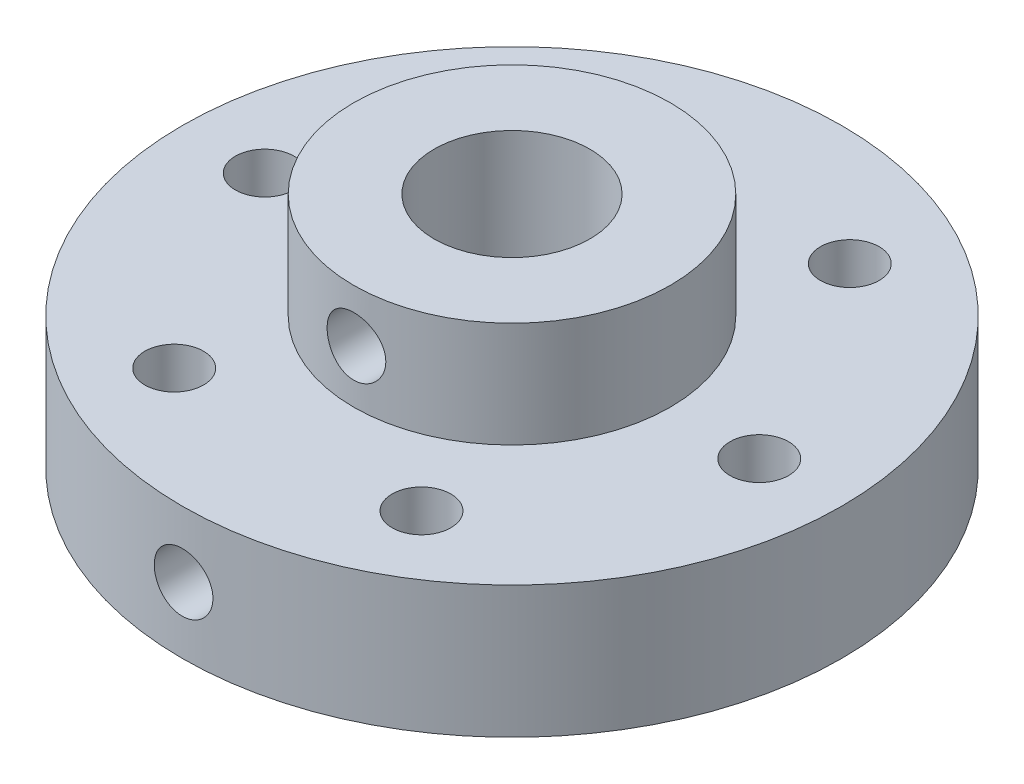
ISO-10303-21;
HEADER;
FILE_DESCRIPTION(('STEP AP214'),'2;1');
FILE_NAME('part.step','',(''),(''),'','','');
FILE_SCHEMA(('AUTOMOTIVE_DESIGN { 1 0 10303 214 1 1 1 1 }'));
ENDSEC;
DATA;
#1=APPLICATION_CONTEXT('core data for automotive mechanical design processes');
#2=APPLICATION_PROTOCOL_DEFINITION('international standard','automotive_design',2000,#1);
#3=PRODUCT_CONTEXT('',#1,'mechanical');
#4=PRODUCT('Part','Part','',(#3));
#5=PRODUCT_RELATED_PRODUCT_CATEGORY('part','',(#4));
#6=PRODUCT_DEFINITION_FORMATION('','',#4);
#7=PRODUCT_DEFINITION_CONTEXT('part definition',#1,'design');
#8=PRODUCT_DEFINITION('design','',#6,#7);
#9=PRODUCT_DEFINITION_SHAPE('','',#8);
#10=(LENGTH_UNIT() NAMED_UNIT(*) SI_UNIT(.MILLI.,.METRE.));
#11=(NAMED_UNIT(*) PLANE_ANGLE_UNIT() SI_UNIT($,.RADIAN.));
#12=(NAMED_UNIT(*) SI_UNIT($,.STERADIAN.) SOLID_ANGLE_UNIT());
#13=UNCERTAINTY_MEASURE_WITH_UNIT(LENGTH_MEASURE(1.E-05),#10,'distance_accuracy_value','');
#14=(GEOMETRIC_REPRESENTATION_CONTEXT(3) GLOBAL_UNCERTAINTY_ASSIGNED_CONTEXT((#13)) GLOBAL_UNIT_ASSIGNED_CONTEXT((#10,
#11,#12)) REPRESENTATION_CONTEXT('',''));
#15=CARTESIAN_POINT('',(0.,0.,0.));
#16=DIRECTION('',(0.,0.,1.));
#17=DIRECTION('',(1.,0.,0.));
#18=AXIS2_PLACEMENT_3D('',#15,#16,#17);
#19=CARTESIAN_POINT('',(0.,5.08,0.));
#20=DIRECTION('',(0.,-1.,0.));
#21=DIRECTION('',(0.,0.,-1.));
#22=AXIS2_PLACEMENT_3D('',#19,#20,#21);
#23=CYLINDRICAL_SURFACE('',#22,12.7);
#24=CARTESIAN_POINT('',(0.,1.40970000000001,12.7));
#25=CARTESIAN_POINT('',(-0.0633549662870578,1.40970275996524,12.6999993442662));
#26=CARTESIAN_POINT('',(-0.126752665207347,1.41504463045691,12.6995208743728));
#27=CARTESIAN_POINT('',(-0.251792843437398,1.43627511603167,12.6976581682521));
#28=CARTESIAN_POINT('',(-0.313433270551566,1.4521755746525,12.6962729149133));
#29=CARTESIAN_POINT('',(-0.433129919396754,1.49405879468067,12.6927531279238));
#30=CARTESIAN_POINT('',(-0.491188190521169,1.52003572804752,12.6906190274599));
#31=CARTESIAN_POINT('',(-0.60210692242587,1.58132379024321,12.68584065064));
#32=CARTESIAN_POINT('',(-0.65496846679239,1.61663296748804,12.6831964809823));
#33=CARTESIAN_POINT('',(-0.754159197131341,1.69569296418049,12.6776859812866));
#34=CARTESIAN_POINT('',(-0.800471309893539,1.73946516761339,12.6748190997262));
#35=CARTESIAN_POINT('',(-0.885101966605945,1.8341633345258,12.6691908973995));
#36=CARTESIAN_POINT('',(-0.923420153597667,1.88508961729169,12.6664295813516));
#37=CARTESIAN_POINT('',(-0.991034006795327,1.99275496911822,12.6613193372878));
#38=CARTESIAN_POINT('',(-1.0203145082189,2.04950359752639,12.6589711052144));
#39=CARTESIAN_POINT('',(-1.06892497046169,2.1671362454533,12.6549594154604));
#40=CARTESIAN_POINT('',(-1.08825512933881,2.22802018263292,12.6532959441501));
#41=CARTESIAN_POINT('',(-1.11636627626064,2.35202297237841,12.6508468875705));
#42=CARTESIAN_POINT('',(-1.12517526603385,2.4151354302412,12.65005897243));
#43=CARTESIAN_POINT('',(-1.13208054267278,2.54194763005313,12.6494429242787));
#44=CARTESIAN_POINT('',(-1.13017705628481,2.60564735954326,12.6496147709531));
#45=CARTESIAN_POINT('',(-1.11573453505945,2.73163364643222,12.6508967086965));
#46=CARTESIAN_POINT('',(-1.10322597749987,2.79392372880229,12.6520041110958));
#47=CARTESIAN_POINT('',(-1.06797575874834,2.91551680096642,12.6550281729631));
#48=CARTESIAN_POINT('',(-1.04523398531445,2.97481975798859,12.6569448413074));
#49=CARTESIAN_POINT('',(-0.990128920983868,3.0888520409167,12.661374570342));
#50=CARTESIAN_POINT('',(-0.957752004966513,3.14357474850884,12.6638884745654));
#51=CARTESIAN_POINT('',(-0.884305528900145,3.246820765042,12.6692286657573));
#52=CARTESIAN_POINT('',(-0.843235767712836,3.29534393049405,12.6720549599532));
#53=CARTESIAN_POINT('',(-0.753398711268006,3.38499064342493,12.6777134478915));
#54=CARTESIAN_POINT('',(-0.704605076649214,3.42608780111356,12.6805456278451));
#55=CARTESIAN_POINT('',(-0.60079709839181,3.49951170078229,12.6858874119665));
#56=CARTESIAN_POINT('',(-0.545782749786353,3.53183843575969,12.6883970158769));
#57=CARTESIAN_POINT('',(-0.431077483891176,3.58680239672926,12.692811467624));
#58=CARTESIAN_POINT('',(-0.371385977360791,3.60943839952807,12.6947162391092));
#59=CARTESIAN_POINT('',(-0.249028930160307,3.64435959074977,12.6977055702252));
#60=CARTESIAN_POINT('',(-0.186363459939341,3.65664502423433,12.698790149275));
#61=CARTESIAN_POINT('',(-0.0600660041406304,3.6704831265007,12.7000144007699));
#62=CARTESIAN_POINT('',(0.00356195903674059,3.6720722351296,12.7001572813243));
#63=CARTESIAN_POINT('',(0.130179123062569,3.66456811790858,12.6994906162937));
#64=CARTESIAN_POINT('',(0.193168330713415,3.65547500593908,12.6986810808622));
#65=CARTESIAN_POINT('',(0.316615641736332,3.62689477944628,12.6962026618106));
#66=CARTESIAN_POINT('',(0.377077698751923,3.60742461024132,12.6945351793369));
#67=CARTESIAN_POINT('',(0.493877017716604,3.55866029739495,12.6905281036814));
#68=CARTESIAN_POINT('',(0.550214205605929,3.52936597741896,12.6881884984357));
#69=CARTESIAN_POINT('',(0.657330068574675,3.46169373241325,12.6830912656799));
#70=CARTESIAN_POINT('',(0.708093479326382,3.42329173027503,12.6803325372428));
#71=CARTESIAN_POINT('',(0.80246657991546,3.33852891040848,12.6747105175415));
#72=CARTESIAN_POINT('',(0.846076127884288,3.29216793488274,12.6718472242049));
#73=CARTESIAN_POINT('',(0.925029072785661,3.19264477851914,12.6663292375558));
#74=CARTESIAN_POINT('',(0.960348646577448,3.1394636596163,12.6636751596436));
#75=CARTESIAN_POINT('',(1.0215555683374,3.0279038233009,12.6588850522987));
#76=CARTESIAN_POINT('',(1.0474430217618,2.96952516400875,12.6567490170742));
#77=CARTESIAN_POINT('',(1.08901049476346,2.8493109072017,12.6532404409206));
#78=CARTESIAN_POINT('',(1.10470496682232,2.78748033987342,12.6518668193799));
#79=CARTESIAN_POINT('',(1.12548797292162,2.66204883559887,12.6500350747212));
#80=CARTESIAN_POINT('',(1.1305767425878,2.59844793801565,12.649576931264));
#81=CARTESIAN_POINT('',(1.13000099869347,2.47151792687397,12.6496283581756));
#82=CARTESIAN_POINT('',(1.12437391313382,2.40818863882937,12.6501345603107));
#83=CARTESIAN_POINT('',(1.10260437390431,2.28337852391187,12.6520504780416));
#84=CARTESIAN_POINT('',(1.08646190541541,2.2218976996441,12.6534601949107));
#85=CARTESIAN_POINT('',(1.04412958765887,2.10252818113132,12.6570234016182));
#86=CARTESIAN_POINT('',(1.01794055344363,2.04463919593201,12.6591768311197));
#87=CARTESIAN_POINT('',(0.956262575165948,1.93407320902907,12.6639849385614));
#88=CARTESIAN_POINT('',(0.920773746892059,1.88139614244489,12.6666396102607));
#89=CARTESIAN_POINT('',(0.841362858948852,1.7825576054641,12.6721621485101));
#90=CARTESIAN_POINT('',(0.797413007717868,1.73641850195347,12.6750306980048));
#91=CARTESIAN_POINT('',(0.702379940550796,1.65215208116953,12.6806515272886));
#92=CARTESIAN_POINT('',(0.651295006881941,1.61402669870939,12.6834037788713));
#93=CARTESIAN_POINT('',(0.543330140990367,1.54681120811584,12.6884875727796));
#94=CARTESIAN_POINT('',(0.486438442445036,1.51773994919049,12.6908182332511));
#95=CARTESIAN_POINT('',(0.368598504243941,1.46960045235025,12.6947861884187));
#96=CARTESIAN_POINT('',(0.307654989327822,1.45052078624174,12.6964242748527));
#97=CARTESIAN_POINT('',(0.205297080416446,1.4277328905001,12.6984048358795));
#98=CARTESIAN_POINT('',(0.164539754289083,1.42097962458262,12.6990002781437));
#99=CARTESIAN_POINT('',(0.0825276628943307,1.41196228730164,12.6997980731845));
#100=CARTESIAN_POINT('',(0.0412728991709902,1.40969820200731,12.7000004271809));
#101=CARTESIAN_POINT('',(0.,1.40970000000001,12.7));
#102=B_SPLINE_CURVE_WITH_KNOTS('',3,(#24,#25,#26,#27,#28,#29,#30,#31,#32,#33,#34,#35,#36,#37,
#38,#39,#40,#41,#42,#43,#44,#45,#46,#47,#48,#49,#50,#51,#52,#53,#54,#55,#56,#57,#58,#59,#60,#61,
#62,#63,#64,#65,#66,#67,#68,#69,#70,#71,#72,#73,#74,#75,#76,#77,#78,#79,#80,#81,#82,#83,#84,#85,
#86,#87,#88,#89,#90,#91,#92,#93,#94,#95,#96,#97,#98,#99,#100,#101),.UNSPECIFIED.,.T.,.F.,(4,2,2,
2,2,2,2,2,2,2,2,2,2,2,2,2,2,2,2,2,2,2,2,2,2,2,2,2,2,2,2,2,2,2,2,2,2,2,4),(0.,0.189914200719066,
0.380041788304177,0.570059573297018,0.760037652656218,0.950502185906145,1.14097522228554,
1.33176614687074,1.52255327368612,1.71283148752738,1.90310567384789,2.09283488891787,
2.28256618506335,2.47256706685702,2.66257234544273,2.85324010665162,3.0439080200977,
3.23459999313065,3.42528745118416,3.6153249519465,3.80536042678587,3.99508652784743,
4.18481603450222,4.37505281433224,4.56529336629959,4.75607410165669,4.94685270391613,
5.13736020994908,5.32786348345201,5.51770259330726,5.70754197069814,5.89736595015787,
6.08718756629666,6.27764366067293,6.46814568561706,6.65904169388162,6.84971887938924,
6.97343978780015,7.09716031227967),.UNSPECIFIED.);
#103=CARTESIAN_POINT('',(0.,1.40970000000001,12.7));
#104=VERTEX_POINT('',#103);
#105=EDGE_CURVE('E10',#104,#104,#102,.T.);
#106=ORIENTED_EDGE('',*,*,#105,.T.);
#107=EDGE_LOOP('',(#106));
#108=FACE_BOUND('',#107,.T.);
#109=CARTESIAN_POINT('',(0.,5.08,0.));
#110=DIRECTION('',(0.,1.,0.));
#111=DIRECTION('',(0.,0.,1.));
#112=AXIS2_PLACEMENT_3D('',#109,#110,#111);
#113=CIRCLE('',#112,12.7);
#114=CARTESIAN_POINT('',(0.,5.08,12.7));
#115=VERTEX_POINT('',#114);
#116=EDGE_CURVE('E49',#115,#115,#113,.T.);
#117=ORIENTED_EDGE('',*,*,#116,.F.);
#118=EDGE_LOOP('',(#117));
#119=FACE_BOUND('',#118,.T.);
#120=CARTESIAN_POINT('',(0.,0.,0.));
#121=DIRECTION('',(0.,1.,0.));
#122=DIRECTION('',(0.,0.,1.));
#123=AXIS2_PLACEMENT_3D('',#120,#121,#122);
#124=CIRCLE('',#123,12.7);
#125=CARTESIAN_POINT('',(0.,0.,12.7));
#126=VERTEX_POINT('',#125);
#127=EDGE_CURVE('E55',#126,#126,#124,.T.);
#128=ORIENTED_EDGE('',*,*,#127,.T.);
#129=EDGE_LOOP('',(#128));
#130=FACE_BOUND('',#129,.T.);
#131=ADVANCED_FACE('F33',(#108,#119,#130),#23,.T.);
#132=CARTESIAN_POINT('',(0.,5.08,0.));
#133=DIRECTION('',(0.,1.,0.));
#134=DIRECTION('',(0.,0.,1.));
#135=AXIS2_PLACEMENT_3D('',#132,#133,#134);
#136=PLANE('',#135);
#137=CARTESIAN_POINT('',(-9.525,5.08,0.));
#138=DIRECTION('',(0.,1.,0.));
#139=DIRECTION('',(0.,0.,1.));
#140=AXIS2_PLACEMENT_3D('',#137,#138,#139);
#141=CIRCLE('',#140,1.13029999999999);
#142=CARTESIAN_POINT('',(-9.525,5.08,1.13029999999999));
#143=VERTEX_POINT('',#142);
#144=EDGE_CURVE('E286',#143,#143,#141,.T.);
#145=ORIENTED_EDGE('',*,*,#144,.F.);
#146=EDGE_LOOP('',(#145));
#147=FACE_BOUND('',#146,.T.);
#148=CARTESIAN_POINT('',(-4.76249999999998,5.08,8.24889197104679));
#149=DIRECTION('',(0.,1.,0.));
#150=DIRECTION('',(0.,0.,1.));
#151=AXIS2_PLACEMENT_3D('',#148,#149,#150);
#152=CIRCLE('',#151,1.13029999999999);
#153=CARTESIAN_POINT('',(-4.76249999999998,5.08,9.37919197104678));
#154=VERTEX_POINT('',#153);
#155=EDGE_CURVE('E280',#154,#154,#152,.T.);
#156=ORIENTED_EDGE('',*,*,#155,.F.);
#157=EDGE_LOOP('',(#156));
#158=FACE_BOUND('',#157,.T.);
#159=CARTESIAN_POINT('',(4.76250000000004,5.08,8.24889197104676));
#160=DIRECTION('',(0.,1.,0.));
#161=DIRECTION('',(0.,0.,1.));
#162=AXIS2_PLACEMENT_3D('',#159,#160,#161);
#163=CIRCLE('',#162,1.13029999999999);
#164=CARTESIAN_POINT('',(4.76250000000004,5.08,9.37919197104675));
#165=VERTEX_POINT('',#164);
#166=EDGE_CURVE('E274',#165,#165,#163,.T.);
#167=ORIENTED_EDGE('',*,*,#166,.F.);
#168=EDGE_LOOP('',(#167));
#169=FACE_BOUND('',#168,.T.);
#170=CARTESIAN_POINT('',(9.525,5.08,0.));
#171=DIRECTION('',(0.,1.,0.));
#172=DIRECTION('',(0.,0.,1.));
#173=AXIS2_PLACEMENT_3D('',#170,#171,#172);
#174=CIRCLE('',#173,1.13029999999999);
#175=CARTESIAN_POINT('',(9.525,5.08,1.13029999999993));
#176=VERTEX_POINT('',#175);
#177=EDGE_CURVE('E268',#176,#176,#174,.T.);
#178=ORIENTED_EDGE('',*,*,#177,.F.);
#179=EDGE_LOOP('',(#178));
#180=FACE_BOUND('',#179,.T.);
#181=CARTESIAN_POINT('',(4.76249999999992,5.08,-8.24889197104682));
#182=DIRECTION('',(0.,1.,0.));
#183=DIRECTION('',(0.,0.,1.));
#184=AXIS2_PLACEMENT_3D('',#181,#182,#183);
#185=CIRCLE('',#184,1.13029999999999);
#186=CARTESIAN_POINT('',(4.76249999999992,5.08,-7.11859197104683));
#187=VERTEX_POINT('',#186);
#188=EDGE_CURVE('E260',#187,#187,#185,.T.);
#189=ORIENTED_EDGE('',*,*,#188,.F.);
#190=EDGE_LOOP('',(#189));
#191=FACE_BOUND('',#190,.T.);
#192=CARTESIAN_POINT('',(-4.7625000000001,5.08,-8.24889197104672));
#193=DIRECTION('',(0.,1.,0.));
#194=DIRECTION('',(0.,0.,1.));
#195=AXIS2_PLACEMENT_3D('',#192,#193,#194);
#196=CIRCLE('',#195,1.13029999999999);
#197=CARTESIAN_POINT('',(-4.7625000000001,5.08,-7.11859197104673));
#198=VERTEX_POINT('',#197);
#199=EDGE_CURVE('E254',#198,#198,#196,.T.);
#200=ORIENTED_EDGE('',*,*,#199,.F.);
#201=EDGE_LOOP('',(#200));
#202=FACE_BOUND('',#201,.T.);
#203=CARTESIAN_POINT('',(0.,5.08,0.));
#204=DIRECTION('',(0.,1.,0.));
#205=DIRECTION('',(0.,0.,1.));
#206=AXIS2_PLACEMENT_3D('',#203,#204,#205);
#207=CIRCLE('',#206,6.096);
#208=CARTESIAN_POINT('',(0.,5.08,6.096));
#209=VERTEX_POINT('',#208);
#210=EDGE_CURVE('E45',#209,#209,#207,.T.);
#211=ORIENTED_EDGE('',*,*,#210,.F.);
#212=EDGE_LOOP('',(#211));
#213=FACE_BOUND('',#212,.T.);
#214=ORIENTED_EDGE('',*,*,#116,.T.);
#215=EDGE_LOOP('',(#214));
#216=FACE_BOUND('',#215,.T.);
#217=ADVANCED_FACE('F98',(#147,#158,#169,#180,#191,#202,#213,#216),#136,.T.);
#218=CARTESIAN_POINT('',(0.,0.,0.));
#219=DIRECTION('',(0.,1.,0.));
#220=DIRECTION('',(0.,0.,1.));
#221=AXIS2_PLACEMENT_3D('',#218,#219,#220);
#222=PLANE('',#221);
#223=CARTESIAN_POINT('',(-9.525,0.,0.));
#224=DIRECTION('',(0.,-1.,0.));
#225=DIRECTION('',(0.,0.,-1.));
#226=AXIS2_PLACEMENT_3D('',#223,#224,#225);
#227=CIRCLE('',#226,1.13029999999999);
#228=CARTESIAN_POINT('',(-9.525,0.,-1.13029999999999));
#229=VERTEX_POINT('',#228);
#230=EDGE_CURVE('E289',#229,#229,#227,.T.);
#231=ORIENTED_EDGE('',*,*,#230,.F.);
#232=EDGE_LOOP('',(#231));
#233=FACE_BOUND('',#232,.T.);
#234=CARTESIAN_POINT('',(-4.76249999999998,0.,8.24889197104679));
#235=DIRECTION('',(0.,-1.,0.));
#236=DIRECTION('',(0.,0.,-1.));
#237=AXIS2_PLACEMENT_3D('',#234,#235,#236);
#238=CIRCLE('',#237,1.13029999999999);
#239=CARTESIAN_POINT('',(-4.76249999999998,0.,7.1185919710468));
#240=VERTEX_POINT('',#239);
#241=EDGE_CURVE('E283',#240,#240,#238,.T.);
#242=ORIENTED_EDGE('',*,*,#241,.F.);
#243=EDGE_LOOP('',(#242));
#244=FACE_BOUND('',#243,.T.);
#245=CARTESIAN_POINT('',(4.76250000000004,0.,8.24889197104676));
#246=DIRECTION('',(0.,-1.,0.));
#247=DIRECTION('',(0.,0.,-1.));
#248=AXIS2_PLACEMENT_3D('',#245,#246,#247);
#249=CIRCLE('',#248,1.13029999999999);
#250=CARTESIAN_POINT('',(4.76250000000004,0.,7.11859197104677));
#251=VERTEX_POINT('',#250);
#252=EDGE_CURVE('E277',#251,#251,#249,.T.);
#253=ORIENTED_EDGE('',*,*,#252,.F.);
#254=EDGE_LOOP('',(#253));
#255=FACE_BOUND('',#254,.T.);
#256=CARTESIAN_POINT('',(9.525,0.,0.));
#257=DIRECTION('',(0.,-1.,0.));
#258=DIRECTION('',(0.,0.,-1.));
#259=AXIS2_PLACEMENT_3D('',#256,#257,#258);
#260=CIRCLE('',#259,1.13029999999999);
#261=CARTESIAN_POINT('',(9.525,0.,-1.13030000000005));
#262=VERTEX_POINT('',#261);
#263=EDGE_CURVE('E271',#262,#262,#260,.T.);
#264=ORIENTED_EDGE('',*,*,#263,.F.);
#265=EDGE_LOOP('',(#264));
#266=FACE_BOUND('',#265,.T.);
#267=CARTESIAN_POINT('',(4.76249999999992,0.,-8.24889197104682));
#268=DIRECTION('',(0.,-1.,0.));
#269=DIRECTION('',(0.,0.,-1.));
#270=AXIS2_PLACEMENT_3D('',#267,#268,#269);
#271=CIRCLE('',#270,1.13029999999999);
#272=CARTESIAN_POINT('',(4.76249999999992,0.,-9.37919197104681));
#273=VERTEX_POINT('',#272);
#274=EDGE_CURVE('E265',#273,#273,#271,.T.);
#275=ORIENTED_EDGE('',*,*,#274,.F.);
#276=EDGE_LOOP('',(#275));
#277=FACE_BOUND('',#276,.T.);
#278=CARTESIAN_POINT('',(-4.7625000000001,0.,-8.24889197104672));
#279=DIRECTION('',(0.,-1.,0.));
#280=DIRECTION('',(0.,0.,-1.));
#281=AXIS2_PLACEMENT_3D('',#278,#279,#280);
#282=CIRCLE('',#281,1.13029999999999);
#283=CARTESIAN_POINT('',(-4.7625000000001,0.,-9.37919197104671));
#284=VERTEX_POINT('',#283);
#285=EDGE_CURVE('E257',#284,#284,#282,.T.);
#286=ORIENTED_EDGE('',*,*,#285,.F.);
#287=EDGE_LOOP('',(#286));
#288=FACE_BOUND('',#287,.T.);
#289=CARTESIAN_POINT('',(0.,0.,0.));
#290=DIRECTION('',(0.,1.,0.));
#291=DIRECTION('',(0.,0.,1.));
#292=AXIS2_PLACEMENT_3D('',#289,#290,#291);
#293=CIRCLE('',#292,3.);
#294=CARTESIAN_POINT('',(0.,0.,3.));
#295=VERTEX_POINT('',#294);
#296=EDGE_CURVE('E81',#295,#295,#293,.T.);
#297=ORIENTED_EDGE('',*,*,#296,.T.);
#298=EDGE_LOOP('',(#297));
#299=FACE_BOUND('',#298,.T.);
#300=ORIENTED_EDGE('',*,*,#127,.F.);
#301=EDGE_LOOP('',(#300));
#302=FACE_BOUND('',#301,.T.);
#303=ADVANCED_FACE('F95',(#233,#244,#255,#266,#277,#288,#299,#302),#222,.F.);
#304=CARTESIAN_POINT('',(0.,9.144,0.));
#305=DIRECTION('',(0.,-1.,0.));
#306=DIRECTION('',(0.,0.,-1.));
#307=AXIS2_PLACEMENT_3D('',#304,#305,#306);
#308=CYLINDRICAL_SURFACE('',#307,6.096);
#309=CARTESIAN_POINT('',(-1.13029999999999,7.112,5.99029531075055));
#310=CARTESIAN_POINT('',(-1.13029757416579,7.17490114976489,5.99029652148722));
#311=CARTESIAN_POINT('',(-1.12503151922218,7.23783392402845,5.99129680916672));
#312=CARTESIAN_POINT('',(-1.10412010577474,7.36192584217755,5.99518503770522));
#313=CARTESIAN_POINT('',(-1.08846586197615,7.42308342091152,5.99807459447521));
#314=CARTESIAN_POINT('',(-1.04727456101979,7.54181145048612,6.00540310371861));
#315=CARTESIAN_POINT('',(-1.0217466101132,7.5993851500057,6.00984062817469));
#316=CARTESIAN_POINT('',(-0.961556516839672,7.70942868953896,6.01976338475298));
#317=CARTESIAN_POINT('',(-0.926895120088989,7.76189894569788,6.02524853134165));
#318=CARTESIAN_POINT('',(-0.848972280997696,7.86088902765961,6.03672307625662));
#319=CARTESIAN_POINT('',(-0.805621161837798,7.90733771053972,6.04271732190618));
#320=CARTESIAN_POINT('',(-0.711743271491409,7.99234648897665,6.05449182640423));
#321=CARTESIAN_POINT('',(-0.661216034547918,8.0309060721045,6.06027207133255));
#322=CARTESIAN_POINT('',(-0.553953548490285,8.09931412958394,6.07101916153294));
#323=CARTESIAN_POINT('',(-0.497174883270272,8.1290956157165,6.07597963097353));
#324=CARTESIAN_POINT('',(-0.379312798252068,8.17867061500115,6.08447403431973));
#325=CARTESIAN_POINT('',(-0.318229724992126,8.19846493115332,6.08800808290952));
#326=CARTESIAN_POINT('',(-0.194229761487205,8.22728395665309,6.09321721733874));
#327=CARTESIAN_POINT('',(-0.131341618813452,8.2364285588967,6.09491298295759));
#328=CARTESIAN_POINT('',(-0.00490238194474088,8.24406206425419,6.0963257388682));
#329=CARTESIAN_POINT('',(0.0586486565521551,8.24255185552278,6.09604289409132));
#330=CARTESIAN_POINT('',(0.183787750631076,8.22901072055979,6.09354648074844));
#331=CARTESIAN_POINT('',(0.245390315449785,8.21710888216025,6.09135660276626));
#332=CARTESIAN_POINT('',(0.365708526982066,8.1833264062903,6.08531873188127));
#333=CARTESIAN_POINT('',(0.424424070128153,8.16144541112184,6.08147067954229));
#334=CARTESIAN_POINT('',(0.537676944464921,8.10820219304517,6.07250915316851));
#335=CARTESIAN_POINT('',(0.592189371017467,8.07678820129048,6.06738879812894));
#336=CARTESIAN_POINT('',(0.695217370658,8.00540883929861,6.05644920323857));
#337=CARTESIAN_POINT('',(0.743732346112558,7.96544261793162,6.05062989385216));
#338=CARTESIAN_POINT('',(0.834152901393785,7.87738145394072,6.03883422688564));
#339=CARTESIAN_POINT('',(0.875948440471175,7.82917358669303,6.03285682289236));
#340=CARTESIAN_POINT('',(0.950877456122145,7.72637419823096,6.02150218728049));
#341=CARTESIAN_POINT('',(0.984010811422474,7.67178258765768,6.01612496406524));
#342=CARTESIAN_POINT('',(1.04070526763079,7.55762139487273,6.00657809368928));
#343=CARTESIAN_POINT('',(1.06425066565392,7.49804383762282,6.00241043069288));
#344=CARTESIAN_POINT('',(1.10096671353653,7.37568384462674,5.99578517153067));
#345=CARTESIAN_POINT('',(1.11413851096087,7.31290176419481,5.99332738621557));
#346=CARTESIAN_POINT('',(1.12957339604394,7.1869063556828,5.99043750086365));
#347=CARTESIAN_POINT('',(1.13199444936165,7.12371303188168,5.98997607008093));
#348=CARTESIAN_POINT('',(1.1262823060014,6.99782499361255,5.99105268824773));
#349=CARTESIAN_POINT('',(1.1181496191153,6.93513025520787,5.9925906406183));
#350=CARTESIAN_POINT('',(1.09169636642754,6.81253653614342,5.99746543836663));
#351=CARTESIAN_POINT('',(1.07345835872109,6.7526191091809,6.00078769969623));
#352=CARTESIAN_POINT('',(1.02739966544086,6.63669057554064,6.00884424998427));
#353=CARTESIAN_POINT('',(0.99957828724279,6.58067975155893,6.01357864099902));
#354=CARTESIAN_POINT('',(0.934778061768042,6.47345770432473,6.02399293969793));
#355=CARTESIAN_POINT('',(0.897699274079229,6.4223078782003,6.02968292851565));
#356=CARTESIAN_POINT('',(0.815571776887527,6.3268990291817,6.04133883051231));
#357=CARTESIAN_POINT('',(0.77052236733288,6.28264061219556,6.04730476789354));
#358=CARTESIAN_POINT('',(0.673027480993471,6.2016821608658,6.05893445483852));
#359=CARTESIAN_POINT('',(0.620493177763803,6.16508827243165,6.06459324632451));
#360=CARTESIAN_POINT('',(0.509930625733235,6.10124618296472,6.07488804514794));
#361=CARTESIAN_POINT('',(0.45190258524986,6.07399762774638,6.07952409124479));
#362=CARTESIAN_POINT('',(0.332295347044894,6.02977925279699,6.08722969652702));
#363=CARTESIAN_POINT('',(0.270736089681084,6.0127569484522,6.09030724145119));
#364=CARTESIAN_POINT('',(0.145570041025816,5.9893066065238,6.0945831235239));
#365=CARTESIAN_POINT('',(0.0819634608904799,5.98287747993136,6.09578165383986));
#366=CARTESIAN_POINT('',(-0.0444730580729111,5.98083321929048,6.09616074044744));
#367=CARTESIAN_POINT('',(-0.107300369544283,5.98505764633735,6.09537123613789));
#368=CARTESIAN_POINT('',(-0.231333589273157,6.00384964821668,6.09192506132192));
#369=CARTESIAN_POINT('',(-0.292539512335625,6.01841712857248,6.08926840787062));
#370=CARTESIAN_POINT('',(-0.411510200425959,6.05741472827571,6.08238628658818));
#371=CARTESIAN_POINT('',(-0.469280609813908,6.08182812708354,6.07816347940373));
#372=CARTESIAN_POINT('',(-0.57992918240851,6.1398054798702,6.06860657743305));
#373=CARTESIAN_POINT('',(-0.63280702728923,6.17337002869224,6.06327241041151));
#374=CARTESIAN_POINT('',(-0.73296989235931,6.2492509077344,6.05198730622661));
#375=CARTESIAN_POINT('',(-0.780166124957189,6.29168332114872,6.0460287715875));
#376=CARTESIAN_POINT('',(-0.86682396540541,6.3838542148682,6.03421491985677));
#377=CARTESIAN_POINT('',(-0.90628375292295,6.43359440983989,6.02835962735155));
#378=CARTESIAN_POINT('',(-0.976682147861281,6.53950506827262,6.01735760276732));
#379=CARTESIAN_POINT('',(-1.00754072648836,6.59572946027455,6.01221773452566));
#380=CARTESIAN_POINT('',(-1.05932528408636,6.71264110272905,6.00331092274622));
#381=CARTESIAN_POINT('',(-1.08026069670412,6.77332405090916,5.99954267604457));
#382=CARTESIAN_POINT('',(-1.10731890218446,6.88049371412305,5.99459679158222));
#383=CARTESIAN_POINT('',(-1.11592214502841,6.92635057095348,5.99299325031106));
#384=CARTESIAN_POINT('',(-1.1274135179484,7.01879917671908,5.99084207513359));
#385=CARTESIAN_POINT('',(-1.13030179751775,7.06539090639914,5.99029441360735));
#386=CARTESIAN_POINT('',(-1.13029999999999,7.112,5.99029531075055));
#387=B_SPLINE_CURVE_WITH_KNOTS('',3,(#309,#310,#311,#312,#313,#314,#315,#316,#317,#318,#319,
#320,#321,#322,#323,#324,#325,#326,#327,#328,#329,#330,#331,#332,#333,#334,#335,#336,#337,#338,
#339,#340,#341,#342,#343,#344,#345,#346,#347,#348,#349,#350,#351,#352,#353,#354,#355,#356,#357,
#358,#359,#360,#361,#362,#363,#364,#365,#366,#367,#368,#369,#370,#371,#372,#373,#374,#375,#376,
#377,#378,#379,#380,#381,#382,#383,#384,#385,#386),.UNSPECIFIED.,.T.,.F.,(4,2,2,2,2,2,2,2,2,2,2,
2,2,2,2,2,2,2,2,2,2,2,2,2,2,2,2,2,2,2,2,2,2,2,2,2,2,2,4),(0.,0.188532896223279,
0.377227257862254,0.565748005208154,0.754253367275455,0.944814746118602,1.13538849876795,
1.32738100594525,1.51935807385615,1.70915233619089,1.89893077800289,2.08638474996377,
2.2738454416501,2.46234292888279,2.65085918437993,2.84220280842739,3.03354911120127,
3.22520754719257,3.41684477826174,3.60565667393126,3.79445944949909,3.98174202145889,
4.16903813183783,4.35845098524705,4.54788048286368,4.73978142011344,4.93167508356632,
5.12257527709718,5.31345584431961,5.5014790335148,5.68950050527005,5.87720401068171,
6.0649197201101,6.25526673946831,6.4456584925742,6.63776669846488,6.82969190490128,
6.96939646213488,7.10909736489669),.UNSPECIFIED.);
#388=CARTESIAN_POINT('',(-1.13029999999999,7.112,5.99029531075055));
#389=VERTEX_POINT('',#388);
#390=EDGE_CURVE('E76',#389,#389,#387,.T.);
#391=ORIENTED_EDGE('',*,*,#390,.T.);
#392=EDGE_LOOP('',(#391));
#393=FACE_BOUND('',#392,.T.);
#394=CARTESIAN_POINT('',(0.,9.144,0.));
#395=DIRECTION('',(0.,1.,0.));
#396=DIRECTION('',(0.,0.,1.));
#397=AXIS2_PLACEMENT_3D('',#394,#395,#396);
#398=CIRCLE('',#397,6.096);
#399=CARTESIAN_POINT('',(0.,9.144,6.096));
#400=VERTEX_POINT('',#399);
#401=EDGE_CURVE('E84',#400,#400,#398,.T.);
#402=ORIENTED_EDGE('',*,*,#401,.F.);
#403=EDGE_LOOP('',(#402));
#404=FACE_BOUND('',#403,.T.);
#405=ORIENTED_EDGE('',*,*,#210,.T.);
#406=EDGE_LOOP('',(#405));
#407=FACE_BOUND('',#406,.T.);
#408=ADVANCED_FACE('F97',(#393,#404,#407),#308,.T.);
#409=CARTESIAN_POINT('',(0.,9.144,0.));
#410=DIRECTION('',(0.,1.,0.));
#411=DIRECTION('',(0.,0.,1.));
#412=AXIS2_PLACEMENT_3D('',#409,#410,#411);
#413=PLANE('',#412);
#414=CARTESIAN_POINT('',(0.,9.144,0.));
#415=DIRECTION('',(0.,1.,0.));
#416=DIRECTION('',(0.,0.,1.));
#417=AXIS2_PLACEMENT_3D('',#414,#415,#416);
#418=CIRCLE('',#417,3.);
#419=CARTESIAN_POINT('',(0.,9.144,3.));
#420=VERTEX_POINT('',#419);
#421=EDGE_CURVE('E75',#420,#420,#418,.T.);
#422=ORIENTED_EDGE('',*,*,#421,.F.);
#423=EDGE_LOOP('',(#422));
#424=FACE_BOUND('',#423,.T.);
#425=ORIENTED_EDGE('',*,*,#401,.T.);
#426=EDGE_LOOP('',(#425));
#427=FACE_BOUND('',#426,.T.);
#428=ADVANCED_FACE('F104',(#424,#427),#413,.T.);
#429=CARTESIAN_POINT('',(0.,0.,0.));
#430=DIRECTION('',(0.,1.,0.));
#431=DIRECTION('',(0.,0.,1.));
#432=AXIS2_PLACEMENT_3D('',#429,#430,#431);
#433=CYLINDRICAL_SURFACE('',#432,3.);
#434=CARTESIAN_POINT('',(0.,5.98170000000001,3.));
#435=CARTESIAN_POINT('',(0.0611928411443488,5.98169771417657,3.00000171846515));
#436=CARTESIAN_POINT('',(0.122370104201509,5.98668483805203,2.99811147393054));
#437=CARTESIAN_POINT('',(0.242895199056459,6.00641991145483,2.99075997725676));
#438=CARTESIAN_POINT('',(0.302243311869403,6.02116635374114,2.98529927654476));
#439=CARTESIAN_POINT('',(0.417354427930662,6.05982374022035,2.97139268185387));
#440=CARTESIAN_POINT('',(0.473124143100639,6.08371690427737,2.96295258193503));
#441=CARTESIAN_POINT('',(0.579859379491466,6.13989861707658,2.94392694144718));
#442=CARTESIAN_POINT('',(0.63082359428782,6.17218943989323,2.93334081990993));
#443=CARTESIAN_POINT('',(0.728683146385696,6.24569340877451,2.91060863113245));
#444=CARTESIAN_POINT('',(0.775345553973623,6.28720279338506,2.89841812878863));
#445=CARTESIAN_POINT('',(0.861234815259451,6.37733670501375,2.87406874410234));
#446=CARTESIAN_POINT('',(0.900459361707662,6.42596343159409,2.86190987272175));
#447=CARTESIAN_POINT('',(0.971847728545221,6.53123581489373,2.83848208116478));
#448=CARTESIAN_POINT('',(1.0036813033119,6.58811823666485,2.82726549498316));
#449=CARTESIAN_POINT('',(1.05722621260478,6.7069185916901,2.80768439036982));
#450=CARTESIAN_POINT('',(1.07894163361981,6.76883448015614,2.79931872088595));
#451=CARTESIAN_POINT('',(1.11071227287925,6.89326202343555,2.78686208746815));
#452=CARTESIAN_POINT('',(1.12121231773436,6.95564329009251,2.78260873846398));
#453=CARTESIAN_POINT('',(1.13164489523888,7.0814162354247,2.7783834729364));
#454=CARTESIAN_POINT('',(1.13158184524543,7.14480748064978,2.77840976671857));
#455=CARTESIAN_POINT('',(1.12122995636935,7.26671709658729,2.78260090856938));
#456=CARTESIAN_POINT('',(1.11156004453705,7.32529823854847,2.78651526327398));
#457=CARTESIAN_POINT('',(1.0832927210565,7.43993525798757,2.79762489847035));
#458=CARTESIAN_POINT('',(1.06469395196105,7.49599075007504,2.80482067782621));
#459=CARTESIAN_POINT('',(1.01875974221826,7.60524032978954,2.82183203740702));
#460=CARTESIAN_POINT('',(0.991264771424986,7.65835966075918,2.83169486850285));
#461=CARTESIAN_POINT('',(0.928429901601707,7.75940946438343,2.85291350507009));
#462=CARTESIAN_POINT('',(0.893087276062987,7.80733812501364,2.86426982886483));
#463=CARTESIAN_POINT('',(0.812735285251822,7.90006938040545,2.88813631917411));
#464=CARTESIAN_POINT('',(0.767232525472829,7.94443881008897,2.90067247694304));
#465=CARTESIAN_POINT('',(0.669288657302436,8.02504658129858,2.92482380153898));
#466=CARTESIAN_POINT('',(0.616846464353868,8.06128364943432,2.93643882394789));
#467=CARTESIAN_POINT('',(0.505398976296977,8.12508187770044,2.95767398522667));
#468=CARTESIAN_POINT('',(0.446303363884753,8.15249748839553,2.96725984391052));
#469=CARTESIAN_POINT('',(0.323887611477128,8.19685382976176,2.98310198289472));
#470=CARTESIAN_POINT('',(0.260569380416554,8.21379925863565,2.98935975640489));
#471=CARTESIAN_POINT('',(0.135150328252682,8.23589848795734,2.99757749960739));
#472=CARTESIAN_POINT('',(0.0731660936979459,8.24163550894338,2.99974980699883));
#473=CARTESIAN_POINT('',(-0.0509103772352719,8.24285493429958,3.0002089165602));
#474=CARTESIAN_POINT('',(-0.113002586279495,8.23833963781162,2.99849658988202));
#475=CARTESIAN_POINT('',(-0.233003651167866,8.21962491480687,2.99151884709839));
#476=CARTESIAN_POINT('',(-0.290981304533441,8.20580866591918,2.98639410224353));
#477=CARTESIAN_POINT('',(-0.403753907940403,8.16938991741725,2.97324875497533));
#478=CARTESIAN_POINT('',(-0.458548443107989,8.1467862754324,2.9652277760581));
#479=CARTESIAN_POINT('',(-0.565210459586958,8.09271196025975,2.94678713567486));
#480=CARTESIAN_POINT('',(-0.616943996823554,8.06099948928289,2.936303721142));
#481=CARTESIAN_POINT('',(-0.714529301622565,7.98988069768726,2.9140961676402));
#482=CARTESIAN_POINT('',(-0.760378872836558,7.95047151782779,2.90237156832864));
#483=CARTESIAN_POINT('',(-0.847704483082616,7.86236221258402,2.8781193062046));
#484=CARTESIAN_POINT('',(-0.888767033445837,7.81325308525346,2.86558483127444));
#485=CARTESIAN_POINT('',(-0.962151409330943,7.70859639683307,2.84178767446505));
#486=CARTESIAN_POINT('',(-0.994472409766734,7.6530482286898,2.83052511269589));
#487=CARTESIAN_POINT('',(-1.04949964581568,7.53660732978498,2.81058987422826));
#488=CARTESIAN_POINT('',(-1.07216204707732,7.4756917156969,2.80192905655408));
#489=CARTESIAN_POINT('',(-1.10675702566343,7.35049101537233,2.78844764505051));
#490=CARTESIAN_POINT('',(-1.118696326937,7.2862080674359,2.78362464492382));
#491=CARTESIAN_POINT('',(-1.13090235870494,7.16058266885129,2.77868657629828));
#492=CARTESIAN_POINT('',(-1.13187504295414,7.09931944353219,2.77828680484727));
#493=CARTESIAN_POINT('',(-1.12393197446695,6.97755115646685,2.78150947741111));
#494=CARTESIAN_POINT('',(-1.11501717788249,6.91704602198289,2.78513153250213));
#495=CARTESIAN_POINT('',(-1.08810379059507,6.80042289240913,2.79575177743842));
#496=CARTESIAN_POINT('',(-1.07039634609333,6.74422697730856,2.8026414595823));
#497=CARTESIAN_POINT('',(-1.02665783694779,6.63557155711729,2.81895651194599));
#498=CARTESIAN_POINT('',(-1.00062465876066,6.58311300492044,2.82838252593414));
#499=CARTESIAN_POINT('',(-0.939379742691679,6.48041090769974,2.84932699073722));
#500=CARTESIAN_POINT('',(-0.903756110803419,6.4304303710602,2.860929617102));
#501=CARTESIAN_POINT('',(-0.824976639766414,6.33693122542972,2.8846324159886));
#502=CARTESIAN_POINT('',(-0.78181839522156,6.29341468828199,2.89673274645469));
#503=CARTESIAN_POINT('',(-0.686366712695304,6.21164499048327,2.92086459755385));
#504=CARTESIAN_POINT('',(-0.6337021265347,6.17381127633756,2.93285596352179));
#505=CARTESIAN_POINT('',(-0.522340920402474,6.10754186085306,2.95472116744885));
#506=CARTESIAN_POINT('',(-0.463643734260857,6.07910704267482,2.96459480638669));
#507=CARTESIAN_POINT('',(-0.338916425945735,6.03154994854684,2.98148834725325));
#508=CARTESIAN_POINT('',(-0.272670783259925,6.01293174086111,2.9883511873005));
#509=CARTESIAN_POINT('',(-0.137609304374554,5.9880112163476,2.99760489853262));
#510=CARTESIAN_POINT('',(-0.0687948076746376,5.98170256979053,2.99999806805049));
#511=CARTESIAN_POINT('',(0.,5.98170000000001,3.));
#512=B_SPLINE_CURVE_WITH_KNOTS('',3,(#434,#435,#436,#437,#438,#439,#440,#441,#442,#443,#444,
#445,#446,#447,#448,#449,#450,#451,#452,#453,#454,#455,#456,#457,#458,#459,#460,#461,#462,#463,
#464,#465,#466,#467,#468,#469,#470,#471,#472,#473,#474,#475,#476,#477,#478,#479,#480,#481,#482,
#483,#484,#485,#486,#487,#488,#489,#490,#491,#492,#493,#494,#495,#496,#497,#498,#499,#500,#501,
#502,#503,#504,#505,#506,#507,#508,#509,#510,#511),.UNSPECIFIED.,.T.,.F.,(4,2,2,2,2,2,2,2,2,2,2,
2,2,2,2,2,2,2,2,2,2,2,2,2,2,2,2,2,2,2,2,2,2,2,2,2,2,2,4),(0.,0.183324752661909,
0.366621199030723,0.549563133529938,0.73255466013301,0.922608205427971,1.11272060987482,
1.31015737819276,1.50751433708923,1.6967144521123,1.88583544615766,2.06351395394755,
2.2412194826204,2.42230689494168,2.60345732113402,2.79690662838166,2.99038620541907,
3.18691140715255,3.38334835950479,3.56925879619647,3.75512754550846,3.93377280938971,
4.11244130511862,4.29637794091192,4.4803830375158,4.67516618994714,4.86996772090744,
5.06564415584765,5.26119780550664,5.44408528035501,5.62695507092464,5.80413727473147,
5.98136449317944,6.16794496469145,6.35458511058965,6.55145930383002,6.74835199095773,
6.95455717859339,7.16065630498673),.UNSPECIFIED.);
#513=CARTESIAN_POINT('',(0.,5.98170000000001,3.));
#514=VERTEX_POINT('',#513);
#515=EDGE_CURVE('E37',#514,#514,#512,.T.);
#516=ORIENTED_EDGE('',*,*,#515,.T.);
#517=EDGE_LOOP('',(#516));
#518=FACE_BOUND('',#517,.T.);
#519=CARTESIAN_POINT('',(0.,1.40970000000001,3.));
#520=CARTESIAN_POINT('',(0.0611928411443488,1.40969771417657,3.00000171846515));
#521=CARTESIAN_POINT('',(0.122370104201509,1.41468483805203,2.99811147393054));
#522=CARTESIAN_POINT('',(0.242895199056459,1.43441991145483,2.99075997725676));
#523=CARTESIAN_POINT('',(0.302243311869403,1.44916635374114,2.98529927654476));
#524=CARTESIAN_POINT('',(0.417354427930662,1.48782374022035,2.97139268185387));
#525=CARTESIAN_POINT('',(0.473124143100639,1.51171690427738,2.96295258193503));
#526=CARTESIAN_POINT('',(0.579859379491466,1.56789861707658,2.94392694144718));
#527=CARTESIAN_POINT('',(0.63082359428782,1.60018943989323,2.93334081990993));
#528=CARTESIAN_POINT('',(0.728683146385696,1.67369340877451,2.91060863113245));
#529=CARTESIAN_POINT('',(0.775345553973623,1.71520279338506,2.89841812878863));
#530=CARTESIAN_POINT('',(0.861234815259451,1.80533670501375,2.87406874410234));
#531=CARTESIAN_POINT('',(0.900459361707662,1.85396343159409,2.86190987272175));
#532=CARTESIAN_POINT('',(0.971847728545221,1.95923581489373,2.83848208116478));
#533=CARTESIAN_POINT('',(1.0036813033119,2.01611823666485,2.82726549498316));
#534=CARTESIAN_POINT('',(1.05722621260478,2.1349185916901,2.80768439036982));
#535=CARTESIAN_POINT('',(1.07894163361981,2.19683448015614,2.79931872088595));
#536=CARTESIAN_POINT('',(1.11071227287925,2.32126202343555,2.78686208746815));
#537=CARTESIAN_POINT('',(1.12121231773436,2.38364329009251,2.78260873846398));
#538=CARTESIAN_POINT('',(1.13164489523888,2.5094162354247,2.7783834729364));
#539=CARTESIAN_POINT('',(1.13158184524543,2.57280748064978,2.77840976671857));
#540=CARTESIAN_POINT('',(1.12122995636935,2.69471709658729,2.78260090856938));
#541=CARTESIAN_POINT('',(1.11156004453705,2.75329823854846,2.78651526327398));
#542=CARTESIAN_POINT('',(1.0832927210565,2.86793525798757,2.79762489847035));
#543=CARTESIAN_POINT('',(1.06469395196105,2.92399075007504,2.80482067782621));
#544=CARTESIAN_POINT('',(1.01875974221826,3.03324032978954,2.82183203740702));
#545=CARTESIAN_POINT('',(0.991264771424987,3.08635966075918,2.83169486850285));
#546=CARTESIAN_POINT('',(0.928429901601708,3.18740946438343,2.85291350507009));
#547=CARTESIAN_POINT('',(0.893087276062987,3.23533812501364,2.86426982886483));
#548=CARTESIAN_POINT('',(0.812735285251822,3.32806938040545,2.88813631917411));
#549=CARTESIAN_POINT('',(0.767232525472829,3.37243881008897,2.90067247694304));
#550=CARTESIAN_POINT('',(0.669288657302438,3.45304658129858,2.92482380153898));
#551=CARTESIAN_POINT('',(0.61684646435387,3.48928364943432,2.93643882394789));
#552=CARTESIAN_POINT('',(0.505398976296979,3.55308187770044,2.95767398522667));
#553=CARTESIAN_POINT('',(0.446303363884755,3.58049748839553,2.96725984391052));
#554=CARTESIAN_POINT('',(0.323887611477129,3.62485382976176,2.98310198289472));
#555=CARTESIAN_POINT('',(0.260569380416555,3.64179925863566,2.98935975640489));
#556=CARTESIAN_POINT('',(0.135150328252682,3.66389848795734,2.99757749960739));
#557=CARTESIAN_POINT('',(0.0731660936979464,3.66963550894338,2.99974980699883));
#558=CARTESIAN_POINT('',(-0.0509103772352714,3.67085493429958,3.0002089165602));
#559=CARTESIAN_POINT('',(-0.113002586279495,3.66633963781162,2.99849658988202));
#560=CARTESIAN_POINT('',(-0.233003651167866,3.64762491480687,2.99151884709839));
#561=CARTESIAN_POINT('',(-0.290981304533441,3.63380866591918,2.98639410224353));
#562=CARTESIAN_POINT('',(-0.403753907940402,3.59738991741725,2.97324875497533));
#563=CARTESIAN_POINT('',(-0.458548443107989,3.5747862754324,2.9652277760581));
#564=CARTESIAN_POINT('',(-0.565210459586957,3.52071196025975,2.94678713567486));
#565=CARTESIAN_POINT('',(-0.616943996823553,3.48899948928289,2.936303721142));
#566=CARTESIAN_POINT('',(-0.714529301622564,3.41788069768727,2.9140961676402));
#567=CARTESIAN_POINT('',(-0.760378872836557,3.37847151782779,2.90237156832864));
#568=CARTESIAN_POINT('',(-0.847704483082615,3.29036221258403,2.8781193062046));
#569=CARTESIAN_POINT('',(-0.888767033445836,3.24125308525347,2.86558483127444));
#570=CARTESIAN_POINT('',(-0.962151409330942,3.13659639683307,2.84178767446505));
#571=CARTESIAN_POINT('',(-0.994472409766733,3.0810482286898,2.83052511269589));
#572=CARTESIAN_POINT('',(-1.04949964581568,2.96460732978498,2.81058987422826));
#573=CARTESIAN_POINT('',(-1.07216204707732,2.9036917156969,2.80192905655408));
#574=CARTESIAN_POINT('',(-1.10675702566343,2.77849101537234,2.78844764505051));
#575=CARTESIAN_POINT('',(-1.118696326937,2.7142080674359,2.78362464492382));
#576=CARTESIAN_POINT('',(-1.13090235870494,2.58858266885129,2.77868657629828));
#577=CARTESIAN_POINT('',(-1.13187504295414,2.52731944353219,2.77828680484727));
#578=CARTESIAN_POINT('',(-1.12393197446695,2.40555115646685,2.78150947741111));
#579=CARTESIAN_POINT('',(-1.11501717788249,2.34504602198289,2.78513153250213));
#580=CARTESIAN_POINT('',(-1.08810379059507,2.22842289240913,2.79575177743842));
#581=CARTESIAN_POINT('',(-1.07039634609333,2.17222697730856,2.8026414595823));
#582=CARTESIAN_POINT('',(-1.02665783694779,2.06357155711729,2.81895651194599));
#583=CARTESIAN_POINT('',(-1.00062465876066,2.01111300492044,2.82838252593414));
#584=CARTESIAN_POINT('',(-0.939379742691679,1.90841090769974,2.84932699073722));
#585=CARTESIAN_POINT('',(-0.903756110803419,1.8584303710602,2.860929617102));
#586=CARTESIAN_POINT('',(-0.824976639766414,1.76493122542972,2.8846324159886));
#587=CARTESIAN_POINT('',(-0.78181839522156,1.72141468828199,2.89673274645469));
#588=CARTESIAN_POINT('',(-0.686366712695305,1.63964499048327,2.92086459755385));
#589=CARTESIAN_POINT('',(-0.6337021265347,1.60181127633756,2.93285596352179));
#590=CARTESIAN_POINT('',(-0.522340920402474,1.53554186085306,2.95472116744885));
#591=CARTESIAN_POINT('',(-0.463643734260858,1.50710704267482,2.96459480638669));
#592=CARTESIAN_POINT('',(-0.338916425945735,1.45954994854684,2.98148834725325));
#593=CARTESIAN_POINT('',(-0.272670783259926,1.44093174086111,2.9883511873005));
#594=CARTESIAN_POINT('',(-0.137609304374554,1.41601121634761,2.99760489853262));
#595=CARTESIAN_POINT('',(-0.0687948076746376,1.40970256979053,2.99999806805049));
#596=CARTESIAN_POINT('',(0.,1.40970000000001,3.));
#597=B_SPLINE_CURVE_WITH_KNOTS('',3,(#519,#520,#521,#522,#523,#524,#525,#526,#527,#528,#529,
#530,#531,#532,#533,#534,#535,#536,#537,#538,#539,#540,#541,#542,#543,#544,#545,#546,#547,#548,
#549,#550,#551,#552,#553,#554,#555,#556,#557,#558,#559,#560,#561,#562,#563,#564,#565,#566,#567,
#568,#569,#570,#571,#572,#573,#574,#575,#576,#577,#578,#579,#580,#581,#582,#583,#584,#585,#586,
#587,#588,#589,#590,#591,#592,#593,#594,#595,#596),.UNSPECIFIED.,.T.,.F.,(4,2,2,2,2,2,2,2,2,2,2,
2,2,2,2,2,2,2,2,2,2,2,2,2,2,2,2,2,2,2,2,2,2,2,2,2,2,2,4),(0.,0.183324752661908,
0.366621199030723,0.549563133529939,0.73255466013301,0.922608205427971,1.11272060987482,
1.31015737819276,1.50751433708923,1.6967144521123,1.88583544615766,2.06351395394754,
2.2412194826204,2.42230689494168,2.60345732113402,2.79690662838166,2.99038620541907,
3.18691140715255,3.38334835950479,3.56925879619646,3.75512754550846,3.93377280938971,
4.11244130511862,4.29637794091192,4.4803830375158,4.67516618994713,4.86996772090744,
5.06564415584765,5.26119780550664,5.44408528035501,5.62695507092464,5.80413727473147,
5.98136449317944,6.16794496469145,6.35458511058965,6.55145930383002,6.74835199095773,
6.95455717859339,7.16065630498673),.UNSPECIFIED.);
#598=CARTESIAN_POINT('',(0.,1.40970000000001,3.));
#599=VERTEX_POINT('',#598);
#600=EDGE_CURVE('E69',#599,#599,#597,.T.);
#601=ORIENTED_EDGE('',*,*,#600,.T.);
#602=EDGE_LOOP('',(#601));
#603=FACE_BOUND('',#602,.T.);
#604=ORIENTED_EDGE('',*,*,#296,.F.);
#605=EDGE_LOOP('',(#604));
#606=FACE_BOUND('',#605,.T.);
#607=ORIENTED_EDGE('',*,*,#421,.T.);
#608=EDGE_LOOP('',(#607));
#609=FACE_BOUND('',#608,.T.);
#610=ADVANCED_FACE('F61',(#518,#603,#606,#609),#433,.F.);
#611=CARTESIAN_POINT('',(0.,2.54,0.));
#612=DIRECTION('',(0.,0.,-1.));
#613=DIRECTION('',(-1.,0.,0.));
#614=AXIS2_PLACEMENT_3D('',#611,#612,#613);
#615=CYLINDRICAL_SURFACE('',#614,1.13029999999999);
#616=ORIENTED_EDGE('',*,*,#105,.F.);
#617=EDGE_LOOP('',(#616));
#618=FACE_BOUND('',#617,.T.);
#619=ORIENTED_EDGE('',*,*,#600,.F.);
#620=EDGE_LOOP('',(#619));
#621=FACE_BOUND('',#620,.T.);
#622=ADVANCED_FACE('F57',(#618,#621),#615,.F.);
#623=CARTESIAN_POINT('',(0.,7.112,0.));
#624=DIRECTION('',(0.,0.,-1.));
#625=DIRECTION('',(-1.,0.,0.));
#626=AXIS2_PLACEMENT_3D('',#623,#624,#625);
#627=CYLINDRICAL_SURFACE('',#626,1.13029999999999);
#628=ORIENTED_EDGE('',*,*,#515,.F.);
#629=EDGE_LOOP('',(#628));
#630=FACE_BOUND('',#629,.T.);
#631=ORIENTED_EDGE('',*,*,#390,.F.);
#632=EDGE_LOOP('',(#631));
#633=FACE_BOUND('',#632,.T.);
#634=ADVANCED_FACE('F60',(#630,#633),#627,.F.);
#635=CARTESIAN_POINT('',(-4.7625000000001,0.,-8.24889197104672));
#636=DIRECTION('',(0.,-1.,0.));
#637=DIRECTION('',(0.,0.,-1.));
#638=AXIS2_PLACEMENT_3D('',#635,#636,#637);
#639=CYLINDRICAL_SURFACE('',#638,1.13029999999999);
#640=ORIENTED_EDGE('',*,*,#199,.T.);
#641=EDGE_LOOP('',(#640));
#642=FACE_BOUND('',#641,.T.);
#643=ORIENTED_EDGE('',*,*,#285,.T.);
#644=EDGE_LOOP('',(#643));
#645=FACE_BOUND('',#644,.T.);
#646=ADVANCED_FACE('F135',(#642,#645),#639,.F.);
#647=CARTESIAN_POINT('',(4.76249999999992,0.,-8.24889197104682));
#648=DIRECTION('',(0.,-1.,0.));
#649=DIRECTION('',(0.,0.,-1.));
#650=AXIS2_PLACEMENT_3D('',#647,#648,#649);
#651=CYLINDRICAL_SURFACE('',#650,1.13029999999999);
#652=ORIENTED_EDGE('',*,*,#188,.T.);
#653=EDGE_LOOP('',(#652));
#654=FACE_BOUND('',#653,.T.);
#655=ORIENTED_EDGE('',*,*,#274,.T.);
#656=EDGE_LOOP('',(#655));
#657=FACE_BOUND('',#656,.T.);
#658=ADVANCED_FACE('F141',(#654,#657),#651,.F.);
#659=CARTESIAN_POINT('',(9.525,0.,0.));
#660=DIRECTION('',(0.,-1.,0.));
#661=DIRECTION('',(0.,0.,-1.));
#662=AXIS2_PLACEMENT_3D('',#659,#660,#661);
#663=CYLINDRICAL_SURFACE('',#662,1.13029999999999);
#664=ORIENTED_EDGE('',*,*,#177,.T.);
#665=EDGE_LOOP('',(#664));
#666=FACE_BOUND('',#665,.T.);
#667=ORIENTED_EDGE('',*,*,#263,.T.);
#668=EDGE_LOOP('',(#667));
#669=FACE_BOUND('',#668,.T.);
#670=ADVANCED_FACE('F152',(#666,#669),#663,.F.);
#671=CARTESIAN_POINT('',(4.76250000000004,0.,8.24889197104676));
#672=DIRECTION('',(0.,-1.,0.));
#673=DIRECTION('',(0.,0.,-1.));
#674=AXIS2_PLACEMENT_3D('',#671,#672,#673);
#675=CYLINDRICAL_SURFACE('',#674,1.13029999999999);
#676=ORIENTED_EDGE('',*,*,#166,.T.);
#677=EDGE_LOOP('',(#676));
#678=FACE_BOUND('',#677,.T.);
#679=ORIENTED_EDGE('',*,*,#252,.T.);
#680=EDGE_LOOP('',(#679));
#681=FACE_BOUND('',#680,.T.);
#682=ADVANCED_FACE('F163',(#678,#681),#675,.F.);
#683=CARTESIAN_POINT('',(-4.76249999999998,0.,8.24889197104679));
#684=DIRECTION('',(0.,-1.,0.));
#685=DIRECTION('',(0.,0.,-1.));
#686=AXIS2_PLACEMENT_3D('',#683,#684,#685);
#687=CYLINDRICAL_SURFACE('',#686,1.13029999999999);
#688=ORIENTED_EDGE('',*,*,#155,.T.);
#689=EDGE_LOOP('',(#688));
#690=FACE_BOUND('',#689,.T.);
#691=ORIENTED_EDGE('',*,*,#241,.T.);
#692=EDGE_LOOP('',(#691));
#693=FACE_BOUND('',#692,.T.);
#694=ADVANCED_FACE('F174',(#690,#693),#687,.F.);
#695=CARTESIAN_POINT('',(-9.525,0.,0.));
#696=DIRECTION('',(0.,-1.,0.));
#697=DIRECTION('',(0.,0.,-1.));
#698=AXIS2_PLACEMENT_3D('',#695,#696,#697);
#699=CYLINDRICAL_SURFACE('',#698,1.13029999999999);
#700=ORIENTED_EDGE('',*,*,#144,.T.);
#701=EDGE_LOOP('',(#700));
#702=FACE_BOUND('',#701,.T.);
#703=ORIENTED_EDGE('',*,*,#230,.T.);
#704=EDGE_LOOP('',(#703));
#705=FACE_BOUND('',#704,.T.);
#706=ADVANCED_FACE('F185',(#702,#705),#699,.F.);
#707=CLOSED_SHELL('',(#131,#217,#303,#408,#428,#610,#622,#634,#646,#658,#670,#682,#694,#706));
#708=MANIFOLD_SOLID_BREP('B2',#707);
#709=ADVANCED_BREP_SHAPE_REPRESENTATION('',(#18,#708),#14);
#710=SHAPE_DEFINITION_REPRESENTATION(#9,#709);
ENDSEC;
END-ISO-10303-21;
